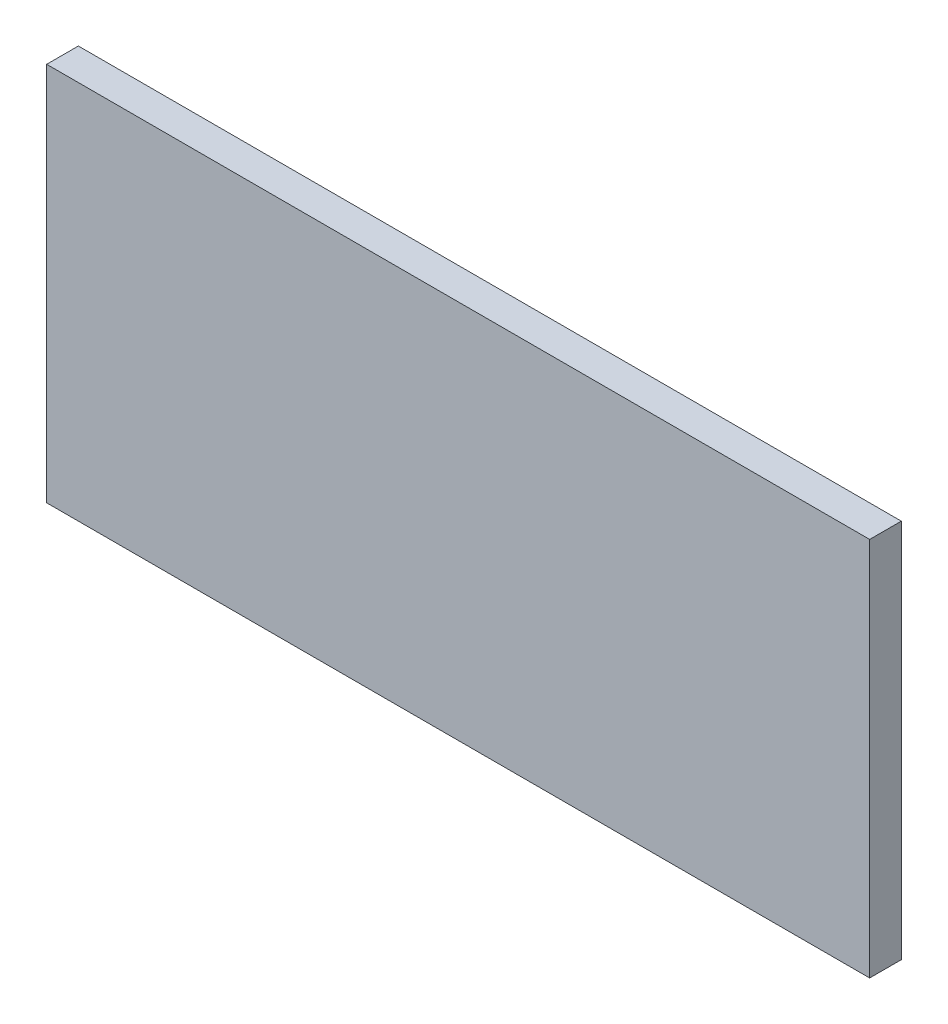
ISO-10303-21;
HEADER;
FILE_DESCRIPTION(('STEP AP214'),'2;1');
FILE_NAME('part.step','',(''),(''),'','','');
FILE_SCHEMA(('AUTOMOTIVE_DESIGN { 1 0 10303 214 1 1 1 1 }'));
ENDSEC;
DATA;
#1=APPLICATION_CONTEXT('core data for automotive mechanical design processes');
#2=APPLICATION_PROTOCOL_DEFINITION('international standard','automotive_design',2000,#1);
#3=PRODUCT_CONTEXT('',#1,'mechanical');
#4=PRODUCT('Part','Part','',(#3));
#5=PRODUCT_RELATED_PRODUCT_CATEGORY('part','',(#4));
#6=PRODUCT_DEFINITION_FORMATION('','',#4);
#7=PRODUCT_DEFINITION_CONTEXT('part definition',#1,'design');
#8=PRODUCT_DEFINITION('design','',#6,#7);
#9=PRODUCT_DEFINITION_SHAPE('','',#8);
#10=(LENGTH_UNIT() NAMED_UNIT(*) SI_UNIT(.MILLI.,.METRE.));
#11=(NAMED_UNIT(*) PLANE_ANGLE_UNIT() SI_UNIT($,.RADIAN.));
#12=(NAMED_UNIT(*) SI_UNIT($,.STERADIAN.) SOLID_ANGLE_UNIT());
#13=UNCERTAINTY_MEASURE_WITH_UNIT(LENGTH_MEASURE(1.E-05),#10,'distance_accuracy_value','');
#14=(GEOMETRIC_REPRESENTATION_CONTEXT(3) GLOBAL_UNCERTAINTY_ASSIGNED_CONTEXT((#13)) GLOBAL_UNIT_ASSIGNED_CONTEXT((#10,
#11,#12)) REPRESENTATION_CONTEXT('',''));
#15=CARTESIAN_POINT('',(0.,0.,0.));
#16=DIRECTION('',(0.,0.,1.));
#17=DIRECTION('',(1.,0.,0.));
#18=AXIS2_PLACEMENT_3D('',#15,#16,#17);
#19=CARTESIAN_POINT('',(0.,0.,0.));
#20=DIRECTION('',(0.,0.,-1.));
#21=DIRECTION('',(-1.,0.,0.));
#22=AXIS2_PLACEMENT_3D('',#19,#20,#21);
#23=PLANE('',#22);
#24=DIRECTION('',(0.,1.,0.));
#25=VECTOR('',#24,1.);
#26=CARTESIAN_POINT('',(-41.275,-19.05,0.));
#27=LINE('',#26,#25);
#28=CARTESIAN_POINT('',(-41.275,-19.05,0.));
#29=VERTEX_POINT('',#28);
#30=CARTESIAN_POINT('',(-41.275,19.05,0.));
#31=VERTEX_POINT('',#30);
#32=EDGE_CURVE('E56',#29,#31,#27,.T.);
#33=ORIENTED_EDGE('',*,*,#32,.T.);
#34=DIRECTION('',(1.,0.,0.));
#35=VECTOR('',#34,1.);
#36=CARTESIAN_POINT('',(-41.275,19.05,0.));
#37=LINE('',#36,#35);
#38=CARTESIAN_POINT('',(41.275,19.05,0.));
#39=VERTEX_POINT('',#38);
#40=EDGE_CURVE('E77',#31,#39,#37,.T.);
#41=ORIENTED_EDGE('',*,*,#40,.T.);
#42=DIRECTION('',(0.,1.,0.));
#43=VECTOR('',#42,1.);
#44=CARTESIAN_POINT('',(41.275,-19.05,0.));
#45=LINE('',#44,#43);
#46=CARTESIAN_POINT('',(41.275,-19.05,0.));
#47=VERTEX_POINT('',#46);
#48=EDGE_CURVE('E59',#39,#47,#45,.F.);
#49=ORIENTED_EDGE('',*,*,#48,.T.);
#50=DIRECTION('',(1.,0.,0.));
#51=VECTOR('',#50,1.);
#52=CARTESIAN_POINT('',(-41.275,-19.05,0.));
#53=LINE('',#52,#51);
#54=EDGE_CURVE('E20',#47,#29,#53,.F.);
#55=ORIENTED_EDGE('',*,*,#54,.T.);
#56=EDGE_LOOP('',(#33,#41,#49,#55));
#57=FACE_BOUND('',#56,.T.);
#58=ADVANCED_FACE('F17',(#57),#23,.T.);
#59=CARTESIAN_POINT('',(-41.275,-19.05,3.175));
#60=DIRECTION('',(0.,1.,0.));
#61=DIRECTION('',(0.,0.,1.));
#62=AXIS2_PLACEMENT_3D('',#59,#60,#61);
#63=PLANE('',#62);
#64=DIRECTION('',(0.,0.,1.));
#65=VECTOR('',#64,1.);
#66=CARTESIAN_POINT('',(41.275,-19.05,3.175));
#67=LINE('',#66,#65);
#68=CARTESIAN_POINT('',(41.275,-19.05,3.175));
#69=VERTEX_POINT('',#68);
#70=EDGE_CURVE('E80',#47,#69,#67,.T.);
#71=ORIENTED_EDGE('',*,*,#70,.T.);
#72=DIRECTION('',(-1.,0.,0.));
#73=VECTOR('',#72,1.);
#74=CARTESIAN_POINT('',(0.,-19.05,3.175));
#75=LINE('',#74,#73);
#76=CARTESIAN_POINT('',(-41.275,-19.05,3.175));
#77=VERTEX_POINT('',#76);
#78=EDGE_CURVE('E74',#69,#77,#75,.T.);
#79=ORIENTED_EDGE('',*,*,#78,.T.);
#80=DIRECTION('',(0.,0.,-1.));
#81=VECTOR('',#80,1.);
#82=CARTESIAN_POINT('',(-41.275,-19.05,3.175));
#83=LINE('',#82,#81);
#84=EDGE_CURVE('E64',#77,#29,#83,.T.);
#85=ORIENTED_EDGE('',*,*,#84,.T.);
#86=ORIENTED_EDGE('',*,*,#54,.F.);
#87=EDGE_LOOP('',(#71,#79,#85,#86));
#88=FACE_BOUND('',#87,.T.);
#89=ADVANCED_FACE('F73',(#88),#63,.F.);
#90=CARTESIAN_POINT('',(-41.275,-19.05,3.175));
#91=DIRECTION('',(1.,0.,0.));
#92=DIRECTION('',(0.,0.,-1.));
#93=AXIS2_PLACEMENT_3D('',#90,#91,#92);
#94=PLANE('',#93);
#95=ORIENTED_EDGE('',*,*,#84,.F.);
#96=DIRECTION('',(0.,1.,0.));
#97=VECTOR('',#96,1.);
#98=CARTESIAN_POINT('',(-41.275,0.,3.175));
#99=LINE('',#98,#97);
#100=CARTESIAN_POINT('',(-41.275,19.05,3.175));
#101=VERTEX_POINT('',#100);
#102=EDGE_CURVE('E85',#77,#101,#99,.T.);
#103=ORIENTED_EDGE('',*,*,#102,.T.);
#104=DIRECTION('',(0.,0.,-1.));
#105=VECTOR('',#104,1.);
#106=CARTESIAN_POINT('',(-41.275,19.05,3.175));
#107=LINE('',#106,#105);
#108=EDGE_CURVE('E70',#101,#31,#107,.T.);
#109=ORIENTED_EDGE('',*,*,#108,.T.);
#110=ORIENTED_EDGE('',*,*,#32,.F.);
#111=EDGE_LOOP('',(#95,#103,#109,#110));
#112=FACE_BOUND('',#111,.T.);
#113=ADVANCED_FACE('F67',(#112),#94,.F.);
#114=CARTESIAN_POINT('',(-41.275,19.05,3.175));
#115=DIRECTION('',(0.,-1.,0.));
#116=DIRECTION('',(0.,0.,-1.));
#117=AXIS2_PLACEMENT_3D('',#114,#115,#116);
#118=PLANE('',#117);
#119=ORIENTED_EDGE('',*,*,#108,.F.);
#120=DIRECTION('',(-1.,0.,0.));
#121=VECTOR('',#120,1.);
#122=CARTESIAN_POINT('',(0.,19.05,3.175));
#123=LINE('',#122,#121);
#124=CARTESIAN_POINT('',(41.275,19.05,3.175));
#125=VERTEX_POINT('',#124);
#126=EDGE_CURVE('E27',#101,#125,#123,.F.);
#127=ORIENTED_EDGE('',*,*,#126,.T.);
#128=DIRECTION('',(0.,0.,1.));
#129=VECTOR('',#128,1.);
#130=CARTESIAN_POINT('',(41.275,19.05,3.175));
#131=LINE('',#130,#129);
#132=EDGE_CURVE('E35',#125,#39,#131,.F.);
#133=ORIENTED_EDGE('',*,*,#132,.T.);
#134=ORIENTED_EDGE('',*,*,#40,.F.);
#135=EDGE_LOOP('',(#119,#127,#133,#134));
#136=FACE_BOUND('',#135,.T.);
#137=ADVANCED_FACE('F92',(#136),#118,.F.);
#138=CARTESIAN_POINT('',(41.275,-19.05,3.175));
#139=DIRECTION('',(-1.,0.,0.));
#140=DIRECTION('',(0.,0.,1.));
#141=AXIS2_PLACEMENT_3D('',#138,#139,#140);
#142=PLANE('',#141);
#143=ORIENTED_EDGE('',*,*,#132,.F.);
#144=DIRECTION('',(0.,1.,0.));
#145=VECTOR('',#144,1.);
#146=CARTESIAN_POINT('',(41.275,0.,3.175));
#147=LINE('',#146,#145);
#148=EDGE_CURVE('E11',#125,#69,#147,.F.);
#149=ORIENTED_EDGE('',*,*,#148,.T.);
#150=ORIENTED_EDGE('',*,*,#70,.F.);
#151=ORIENTED_EDGE('',*,*,#48,.F.);
#152=EDGE_LOOP('',(#143,#149,#150,#151));
#153=FACE_BOUND('',#152,.T.);
#154=ADVANCED_FACE('F95',(#153),#142,.F.);
#155=CARTESIAN_POINT('',(0.,0.,3.175));
#156=DIRECTION('',(0.,0.,-1.));
#157=DIRECTION('',(-1.,0.,0.));
#158=AXIS2_PLACEMENT_3D('',#155,#156,#157);
#159=PLANE('',#158);
#160=ORIENTED_EDGE('',*,*,#126,.F.);
#161=ORIENTED_EDGE('',*,*,#102,.F.);
#162=ORIENTED_EDGE('',*,*,#78,.F.);
#163=ORIENTED_EDGE('',*,*,#148,.F.);
#164=EDGE_LOOP('',(#160,#161,#162,#163));
#165=FACE_BOUND('',#164,.T.);
#166=ADVANCED_FACE('F94',(#165),#159,.F.);
#167=CLOSED_SHELL('',(#58,#89,#113,#137,#154,#166));
#168=MANIFOLD_SOLID_BREP('B1',#167);
#169=ADVANCED_BREP_SHAPE_REPRESENTATION('',(#18,#168),#14);
#170=SHAPE_DEFINITION_REPRESENTATION(#9,#169);
ENDSEC;
END-ISO-10303-21;
